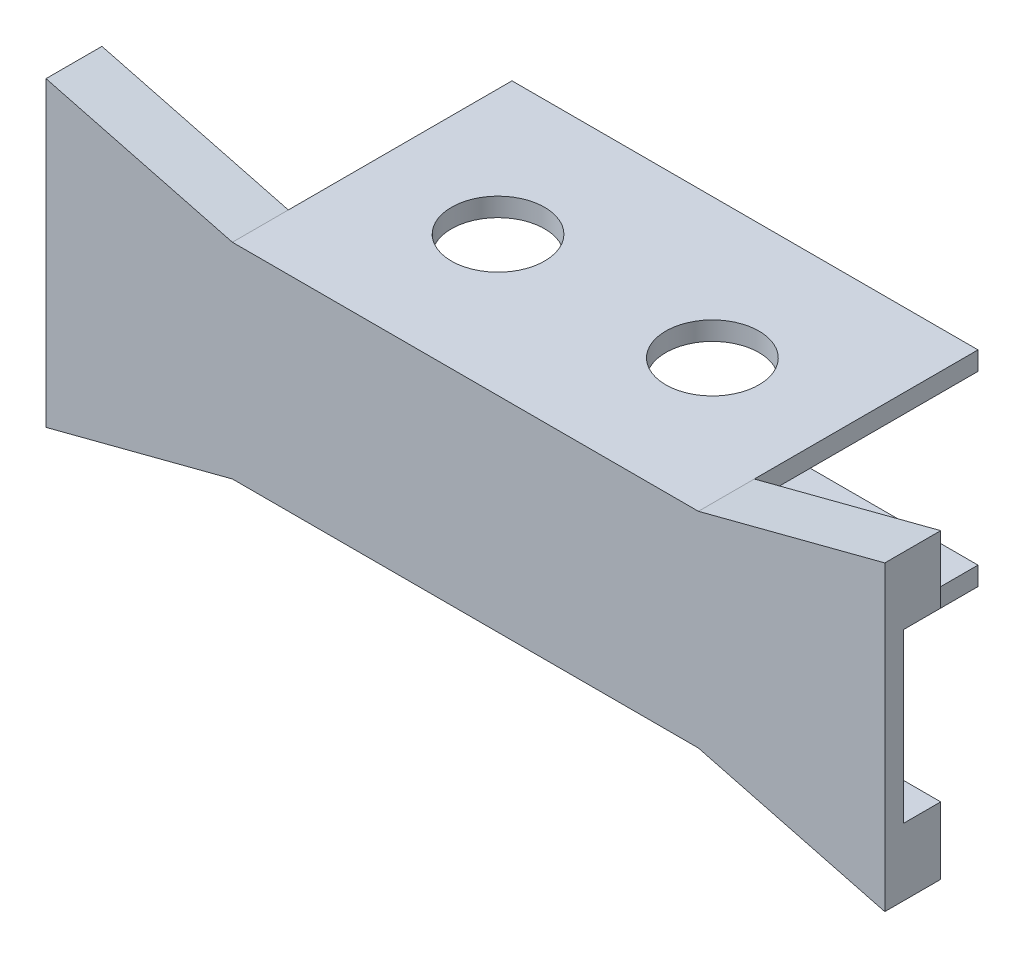
ISO-10303-21;
HEADER;
FILE_DESCRIPTION(('STEP AP214'),'2;1');
FILE_NAME('part.step','',(''),(''),'','','');
FILE_SCHEMA(('AUTOMOTIVE_DESIGN { 1 0 10303 214 1 1 1 1 }'));
ENDSEC;
DATA;
#1=APPLICATION_CONTEXT('core data for automotive mechanical design processes');
#2=APPLICATION_PROTOCOL_DEFINITION('international standard','automotive_design',2000,#1);
#3=PRODUCT_CONTEXT('',#1,'mechanical');
#4=PRODUCT('Part','Part','',(#3));
#5=PRODUCT_RELATED_PRODUCT_CATEGORY('part','',(#4));
#6=PRODUCT_DEFINITION_FORMATION('','',#4);
#7=PRODUCT_DEFINITION_CONTEXT('part definition',#1,'design');
#8=PRODUCT_DEFINITION('design','',#6,#7);
#9=PRODUCT_DEFINITION_SHAPE('','',#8);
#10=(LENGTH_UNIT() NAMED_UNIT(*) SI_UNIT(.MILLI.,.METRE.));
#11=(NAMED_UNIT(*) PLANE_ANGLE_UNIT() SI_UNIT($,.RADIAN.));
#12=(NAMED_UNIT(*) SI_UNIT($,.STERADIAN.) SOLID_ANGLE_UNIT());
#13=UNCERTAINTY_MEASURE_WITH_UNIT(LENGTH_MEASURE(1.E-05),#10,'distance_accuracy_value','');
#14=(GEOMETRIC_REPRESENTATION_CONTEXT(3) GLOBAL_UNCERTAINTY_ASSIGNED_CONTEXT((#13)) GLOBAL_UNIT_ASSIGNED_CONTEXT((#10,
#11,#12)) REPRESENTATION_CONTEXT('',''));
#15=CARTESIAN_POINT('',(0.,0.,0.));
#16=DIRECTION('',(0.,0.,1.));
#17=DIRECTION('',(1.,0.,0.));
#18=AXIS2_PLACEMENT_3D('',#15,#16,#17);
#19=CARTESIAN_POINT('',(-43.8144329896907,2.,0.));
#20=DIRECTION('',(-1.,0.,0.));
#21=DIRECTION('',(0.,0.,1.));
#22=AXIS2_PLACEMENT_3D('',#19,#20,#21);
#23=PLANE('',#22);
#24=DIRECTION('',(0.,0.,-1.));
#25=VECTOR('',#24,1.);
#26=CARTESIAN_POINT('',(-43.8144329896907,0.,0.));
#27=LINE('',#26,#25);
#28=CARTESIAN_POINT('',(-43.8144329896907,0.,8.07216494845362));
#29=VERTEX_POINT('',#28);
#30=CARTESIAN_POINT('',(-43.8144329896907,0.,-15.9278350515464));
#31=VERTEX_POINT('',#30);
#32=EDGE_CURVE('E73',#29,#31,#27,.T.);
#33=ORIENTED_EDGE('',*,*,#32,.F.);
#34=DIRECTION('',(0.,-1.,0.));
#35=VECTOR('',#34,1.);
#36=CARTESIAN_POINT('',(-43.8144329896907,0.,8.07216494845362));
#37=LINE('',#36,#35);
#38=CARTESIAN_POINT('',(-43.8144329896907,2.,8.07216494845362));
#39=VERTEX_POINT('',#38);
#40=EDGE_CURVE('E291',#39,#29,#37,.T.);
#41=ORIENTED_EDGE('',*,*,#40,.F.);
#42=DIRECTION('',(0.,0.,-1.));
#43=VECTOR('',#42,1.);
#44=CARTESIAN_POINT('',(-43.8144329896907,2.,0.));
#45=LINE('',#44,#43);
#46=CARTESIAN_POINT('',(-43.8144329896907,2.,-15.9278350515464));
#47=VERTEX_POINT('',#46);
#48=EDGE_CURVE('E310',#39,#47,#45,.T.);
#49=ORIENTED_EDGE('',*,*,#48,.T.);
#50=DIRECTION('',(0.,-1.,0.));
#51=VECTOR('',#50,1.);
#52=CARTESIAN_POINT('',(-43.8144329896907,2.,-15.9278350515464));
#53=LINE('',#52,#51);
#54=EDGE_CURVE('E47',#47,#31,#53,.T.);
#55=ORIENTED_EDGE('',*,*,#54,.T.);
#56=EDGE_LOOP('',(#33,#41,#49,#55));
#57=FACE_BOUND('',#56,.T.);
#58=ADVANCED_FACE('F43',(#57),#23,.T.);
#59=CARTESIAN_POINT('',(6.18556701030928,2.,0.));
#60=DIRECTION('',(-1.,0.,0.));
#61=DIRECTION('',(0.,0.,1.));
#62=AXIS2_PLACEMENT_3D('',#59,#60,#61);
#63=PLANE('',#62);
#64=DIRECTION('',(0.,1.,0.));
#65=VECTOR('',#64,1.);
#66=CARTESIAN_POINT('',(6.18556701030928,0.,8.07216494845362));
#67=LINE('',#66,#65);
#68=CARTESIAN_POINT('',(6.18556701030928,0.,8.07216494845362));
#69=VERTEX_POINT('',#68);
#70=CARTESIAN_POINT('',(6.18556701030928,2.,8.07216494845362));
#71=VERTEX_POINT('',#70);
#72=EDGE_CURVE('E271',#69,#71,#67,.T.);
#73=ORIENTED_EDGE('',*,*,#72,.F.);
#74=DIRECTION('',(0.,0.,-1.));
#75=VECTOR('',#74,1.);
#76=CARTESIAN_POINT('',(6.18556701030928,0.,0.));
#77=LINE('',#76,#75);
#78=CARTESIAN_POINT('',(6.18556701030928,0.,-15.9278350515464));
#79=VERTEX_POINT('',#78);
#80=EDGE_CURVE('E329',#69,#79,#77,.T.);
#81=ORIENTED_EDGE('',*,*,#80,.T.);
#82=DIRECTION('',(0.,-1.,0.));
#83=VECTOR('',#82,1.);
#84=CARTESIAN_POINT('',(6.18556701030928,2.,-15.9278350515464));
#85=LINE('',#84,#83);
#86=CARTESIAN_POINT('',(6.18556701030928,2.,-15.9278350515464));
#87=VERTEX_POINT('',#86);
#88=EDGE_CURVE('E325',#87,#79,#85,.T.);
#89=ORIENTED_EDGE('',*,*,#88,.F.);
#90=DIRECTION('',(0.,0.,-1.));
#91=VECTOR('',#90,1.);
#92=CARTESIAN_POINT('',(6.18556701030928,2.,0.));
#93=LINE('',#92,#91);
#94=EDGE_CURVE('E61',#71,#87,#93,.T.);
#95=ORIENTED_EDGE('',*,*,#94,.F.);
#96=EDGE_LOOP('',(#73,#81,#89,#95));
#97=FACE_BOUND('',#96,.T.);
#98=ADVANCED_FACE('F346',(#97),#63,.F.);
#99=CARTESIAN_POINT('',(0.,0.,0.));
#100=DIRECTION('',(0.,1.,0.));
#101=DIRECTION('',(0.,0.,1.));
#102=AXIS2_PLACEMENT_3D('',#99,#100,#101);
#103=PLANE('',#102);
#104=CARTESIAN_POINT('',(-30.3144329896907,0.,-0.927835051546382));
#105=DIRECTION('',(0.,1.,0.));
#106=DIRECTION('',(0.,0.,1.));
#107=AXIS2_PLACEMENT_3D('',#104,#105,#106);
#108=CIRCLE('',#107,5.);
#109=CARTESIAN_POINT('',(-30.3144329896907,0.,4.07216494845362));
#110=VERTEX_POINT('',#109);
#111=EDGE_CURVE('E311',#110,#110,#108,.T.);
#112=ORIENTED_EDGE('',*,*,#111,.T.);
#113=EDGE_LOOP('',(#112));
#114=FACE_BOUND('',#113,.T.);
#115=CARTESIAN_POINT('',(-7.31443298969072,0.,-0.927835051546382));
#116=DIRECTION('',(0.,1.,0.));
#117=DIRECTION('',(0.,0.,1.));
#118=AXIS2_PLACEMENT_3D('',#115,#116,#117);
#119=CIRCLE('',#118,5.);
#120=CARTESIAN_POINT('',(-7.31443298969072,0.,4.07216494845362));
#121=VERTEX_POINT('',#120);
#122=EDGE_CURVE('E331',#121,#121,#119,.T.);
#123=ORIENTED_EDGE('',*,*,#122,.T.);
#124=EDGE_LOOP('',(#123));
#125=FACE_BOUND('',#124,.T.);
#126=DIRECTION('',(1.,0.,0.));
#127=VECTOR('',#126,1.);
#128=CARTESIAN_POINT('',(0.,0.,12.0721649484536));
#129=LINE('',#128,#127);
#130=CARTESIAN_POINT('',(-63.8144329896907,0.,12.0721649484536));
#131=VERTEX_POINT('',#130);
#132=CARTESIAN_POINT('',(26.1855670103093,0.,12.0721649484536));
#133=VERTEX_POINT('',#132);
#134=EDGE_CURVE('E11',#131,#133,#129,.T.);
#135=ORIENTED_EDGE('',*,*,#134,.F.);
#136=DIRECTION('',(0.,0.,1.));
#137=VECTOR('',#136,1.);
#138=CARTESIAN_POINT('',(-63.8144329896907,0.,8.07216494845362));
#139=LINE('',#138,#137);
#140=CARTESIAN_POINT('',(-63.8144329896907,0.,8.07216494845362));
#141=VERTEX_POINT('',#140);
#142=EDGE_CURVE('E279',#141,#131,#139,.T.);
#143=ORIENTED_EDGE('',*,*,#142,.F.);
#144=DIRECTION('',(-1.,0.,0.));
#145=VECTOR('',#144,1.);
#146=CARTESIAN_POINT('',(0.,0.,8.07216494845362));
#147=LINE('',#146,#145);
#148=EDGE_CURVE('E289',#29,#141,#147,.T.);
#149=ORIENTED_EDGE('',*,*,#148,.F.);
#150=ORIENTED_EDGE('',*,*,#32,.T.);
#151=DIRECTION('',(-1.,0.,0.));
#152=VECTOR('',#151,1.);
#153=CARTESIAN_POINT('',(0.,0.,-15.9278350515464));
#154=LINE('',#153,#152);
#155=EDGE_CURVE('E305',#79,#31,#154,.T.);
#156=ORIENTED_EDGE('',*,*,#155,.F.);
#157=ORIENTED_EDGE('',*,*,#80,.F.);
#158=DIRECTION('',(1.,0.,0.));
#159=VECTOR('',#158,1.);
#160=CARTESIAN_POINT('',(0.,0.,8.07216494845362));
#161=LINE('',#160,#159);
#162=CARTESIAN_POINT('',(26.1855670103093,0.,8.07216494845362));
#163=VERTEX_POINT('',#162);
#164=EDGE_CURVE('E273',#69,#163,#161,.T.);
#165=ORIENTED_EDGE('',*,*,#164,.T.);
#166=DIRECTION('',(0.,0.,1.));
#167=VECTOR('',#166,1.);
#168=CARTESIAN_POINT('',(26.1855670103093,0.,8.07216494845362));
#169=LINE('',#168,#167);
#170=EDGE_CURVE('E280',#163,#133,#169,.T.);
#171=ORIENTED_EDGE('',*,*,#170,.T.);
#172=EDGE_LOOP('',(#135,#143,#149,#150,#156,#157,#165,#171));
#173=FACE_BOUND('',#172,.T.);
#174=ADVANCED_FACE('F343',(#114,#125,#173),#103,.F.);
#175=CARTESIAN_POINT('',(0.,2.,-15.9278350515464));
#176=DIRECTION('',(0.,0.,1.));
#177=DIRECTION('',(1.,0.,0.));
#178=AXIS2_PLACEMENT_3D('',#175,#176,#177);
#179=PLANE('',#178);
#180=ORIENTED_EDGE('',*,*,#155,.T.);
#181=ORIENTED_EDGE('',*,*,#54,.F.);
#182=DIRECTION('',(-1.,0.,0.));
#183=VECTOR('',#182,1.);
#184=CARTESIAN_POINT('',(0.,2.,-15.9278350515464));
#185=LINE('',#184,#183);
#186=EDGE_CURVE('E308',#87,#47,#185,.T.);
#187=ORIENTED_EDGE('',*,*,#186,.F.);
#188=ORIENTED_EDGE('',*,*,#88,.T.);
#189=EDGE_LOOP('',(#180,#181,#187,#188));
#190=FACE_BOUND('',#189,.T.);
#191=ADVANCED_FACE('F45',(#190),#179,.F.);
#192=CARTESIAN_POINT('',(0.,2.,14.0721649484536));
#193=DIRECTION('',(0.,0.,1.));
#194=DIRECTION('',(1.,0.,0.));
#195=AXIS2_PLACEMENT_3D('',#192,#193,#194);
#196=PLANE('',#195);
#197=DIRECTION('',(-1.,0.,0.));
#198=VECTOR('',#197,1.);
#199=CARTESIAN_POINT('',(0.,2.,14.0721649484536));
#200=LINE('',#199,#198);
#201=CARTESIAN_POINT('',(6.18556701030928,2.,14.0721649484536));
#202=VERTEX_POINT('',#201);
#203=CARTESIAN_POINT('',(-43.8144329896907,2.,14.0721649484536));
#204=VERTEX_POINT('',#203);
#205=EDGE_CURVE('E314',#202,#204,#200,.T.);
#206=ORIENTED_EDGE('',*,*,#205,.T.);
#207=DIRECTION('',(-0.967786736386229,0.251771390103984,0.));
#208=VECTOR('',#207,1.);
#209=CARTESIAN_POINT('',(-2.29002374640336,-8.80264674577735,14.0721649484536));
#210=LINE('',#209,#208);
#211=CARTESIAN_POINT('',(-63.8144329896907,7.20303452481923,14.0721649484536));
#212=VERTEX_POINT('',#211);
#213=EDGE_CURVE('E229',#204,#212,#210,.T.);
#214=ORIENTED_EDGE('',*,*,#213,.T.);
#215=DIRECTION('',(0.,-1.,0.));
#216=VECTOR('',#215,1.);
#217=CARTESIAN_POINT('',(-63.8144329896907,0.,14.0721649484536));
#218=LINE('',#217,#216);
#219=CARTESIAN_POINT('',(-63.8144329896907,-25.2030345248192,14.0721649484536));
#220=VERTEX_POINT('',#219);
#221=EDGE_CURVE('E302',#212,#220,#218,.T.);
#222=ORIENTED_EDGE('',*,*,#221,.T.);
#223=DIRECTION('',(-0.967786736386229,-0.251771390103984,0.));
#224=VECTOR('',#223,1.);
#225=CARTESIAN_POINT('',(-2.29002374640336,-9.19735325422265,14.0721649484536));
#226=LINE('',#225,#224);
#227=CARTESIAN_POINT('',(-43.8144329896907,-20.,14.0721649484536));
#228=VERTEX_POINT('',#227);
#229=EDGE_CURVE('E210',#228,#220,#226,.T.);
#230=ORIENTED_EDGE('',*,*,#229,.F.);
#231=DIRECTION('',(-1.,0.,0.));
#232=VECTOR('',#231,1.);
#233=CARTESIAN_POINT('',(0.,-20.,14.0721649484536));
#234=LINE('',#233,#232);
#235=CARTESIAN_POINT('',(6.18556701030928,-20.,14.0721649484536));
#236=VERTEX_POINT('',#235);
#237=EDGE_CURVE('E238',#236,#228,#234,.T.);
#238=ORIENTED_EDGE('',*,*,#237,.F.);
#239=DIRECTION('',(0.967786736386229,-0.251771390103984,0.));
#240=VECTOR('',#239,1.);
#241=CARTESIAN_POINT('',(-0.095226150435374,-18.3660408170698,14.0721649484536));
#242=LINE('',#241,#240);
#243=CARTESIAN_POINT('',(26.1855670103093,-25.2030345248192,14.0721649484536));
#244=VERTEX_POINT('',#243);
#245=EDGE_CURVE('E195',#236,#244,#242,.T.);
#246=ORIENTED_EDGE('',*,*,#245,.T.);
#247=DIRECTION('',(0.,-1.,0.));
#248=VECTOR('',#247,1.);
#249=CARTESIAN_POINT('',(26.1855670103093,0.,14.0721649484536));
#250=LINE('',#249,#248);
#251=CARTESIAN_POINT('',(26.1855670103093,7.20303452481923,14.0721649484536));
#252=VERTEX_POINT('',#251);
#253=EDGE_CURVE('E199',#252,#244,#250,.T.);
#254=ORIENTED_EDGE('',*,*,#253,.F.);
#255=DIRECTION('',(0.967786736386229,0.251771390103984,0.));
#256=VECTOR('',#255,1.);
#257=CARTESIAN_POINT('',(-0.095226150435374,0.366040817069852,14.0721649484536));
#258=LINE('',#257,#256);
#259=EDGE_CURVE('E269',#202,#252,#258,.T.);
#260=ORIENTED_EDGE('',*,*,#259,.F.);
#261=EDGE_LOOP('',(#206,#214,#222,#230,#238,#246,#254,#260));
#262=FACE_BOUND('',#261,.T.);
#263=ADVANCED_FACE('F378',(#262),#196,.T.);
#264=CARTESIAN_POINT('',(-7.31443298969072,2.,-0.927835051546382));
#265=DIRECTION('',(0.,-1.,0.));
#266=DIRECTION('',(0.,0.,-1.));
#267=AXIS2_PLACEMENT_3D('',#264,#265,#266);
#268=CYLINDRICAL_SURFACE('',#267,5.);
#269=CARTESIAN_POINT('',(-7.31443298969072,2.,-0.927835051546382));
#270=DIRECTION('',(0.,1.,0.));
#271=DIRECTION('',(0.,0.,1.));
#272=AXIS2_PLACEMENT_3D('',#269,#270,#271);
#273=CIRCLE('',#272,5.);
#274=CARTESIAN_POINT('',(-7.31443298969072,2.,4.07216494845362));
#275=VERTEX_POINT('',#274);
#276=EDGE_CURVE('E319',#275,#275,#273,.T.);
#277=ORIENTED_EDGE('',*,*,#276,.T.);
#278=EDGE_LOOP('',(#277));
#279=FACE_BOUND('',#278,.T.);
#280=ORIENTED_EDGE('',*,*,#122,.F.);
#281=EDGE_LOOP('',(#280));
#282=FACE_BOUND('',#281,.T.);
#283=ADVANCED_FACE('F414',(#279,#282),#268,.F.);
#284=CARTESIAN_POINT('',(-30.3144329896907,2.,-0.927835051546382));
#285=DIRECTION('',(0.,-1.,0.));
#286=DIRECTION('',(0.,0.,-1.));
#287=AXIS2_PLACEMENT_3D('',#284,#285,#286);
#288=CYLINDRICAL_SURFACE('',#287,5.);
#289=CARTESIAN_POINT('',(-30.3144329896907,2.,-0.927835051546382));
#290=DIRECTION('',(0.,1.,0.));
#291=DIRECTION('',(0.,0.,1.));
#292=AXIS2_PLACEMENT_3D('',#289,#290,#291);
#293=CIRCLE('',#292,5.);
#294=CARTESIAN_POINT('',(-30.3144329896907,2.,4.07216494845362));
#295=VERTEX_POINT('',#294);
#296=EDGE_CURVE('E322',#295,#295,#293,.T.);
#297=ORIENTED_EDGE('',*,*,#296,.T.);
#298=EDGE_LOOP('',(#297));
#299=FACE_BOUND('',#298,.T.);
#300=ORIENTED_EDGE('',*,*,#111,.F.);
#301=EDGE_LOOP('',(#300));
#302=FACE_BOUND('',#301,.T.);
#303=ADVANCED_FACE('F418',(#299,#302),#288,.F.);
#304=CARTESIAN_POINT('',(0.,2.,0.));
#305=DIRECTION('',(0.,1.,0.));
#306=DIRECTION('',(0.,0.,1.));
#307=AXIS2_PLACEMENT_3D('',#304,#305,#306);
#308=PLANE('',#307);
#309=ORIENTED_EDGE('',*,*,#186,.T.);
#310=ORIENTED_EDGE('',*,*,#48,.F.);
#311=EDGE_CURVE('E312',#204,#39,#45,.T.);
#312=ORIENTED_EDGE('',*,*,#311,.F.);
#313=ORIENTED_EDGE('',*,*,#205,.F.);
#314=EDGE_CURVE('E317',#202,#71,#93,.T.);
#315=ORIENTED_EDGE('',*,*,#314,.T.);
#316=ORIENTED_EDGE('',*,*,#94,.T.);
#317=EDGE_LOOP('',(#309,#310,#312,#313,#315,#316));
#318=FACE_BOUND('',#317,.T.);
#319=ORIENTED_EDGE('',*,*,#276,.F.);
#320=EDGE_LOOP('',(#319));
#321=FACE_BOUND('',#320,.T.);
#322=ORIENTED_EDGE('',*,*,#296,.F.);
#323=EDGE_LOOP('',(#322));
#324=FACE_BOUND('',#323,.T.);
#325=ADVANCED_FACE('F422',(#318,#321,#324),#308,.T.);
#326=CARTESIAN_POINT('',(26.1855670103093,0.,12.0721649484536));
#327=DIRECTION('',(-1.,0.,0.));
#328=DIRECTION('',(0.,0.,1.));
#329=AXIS2_PLACEMENT_3D('',#326,#327,#328);
#330=PLANE('',#329);
#331=ORIENTED_EDGE('',*,*,#253,.T.);
#332=DIRECTION('',(0.,0.,1.));
#333=VECTOR('',#332,1.);
#334=CARTESIAN_POINT('',(26.1855670103093,-25.2030345248192,8.07216494845362));
#335=LINE('',#334,#333);
#336=CARTESIAN_POINT('',(26.1855670103093,-25.2030345248192,8.07216494845362));
#337=VERTEX_POINT('',#336);
#338=EDGE_CURVE('E180',#337,#244,#335,.T.);
#339=ORIENTED_EDGE('',*,*,#338,.F.);
#340=DIRECTION('',(0.,1.,0.));
#341=VECTOR('',#340,1.);
#342=CARTESIAN_POINT('',(26.1855670103093,-18.,8.07216494845362));
#343=LINE('',#342,#341);
#344=CARTESIAN_POINT('',(26.1855670103093,-18.,8.07216494845362));
#345=VERTEX_POINT('',#344);
#346=EDGE_CURVE('E187',#337,#345,#343,.T.);
#347=ORIENTED_EDGE('',*,*,#346,.T.);
#348=DIRECTION('',(0.,0.,1.));
#349=VECTOR('',#348,1.);
#350=CARTESIAN_POINT('',(26.1855670103093,-18.,8.07216494845362));
#351=LINE('',#350,#349);
#352=CARTESIAN_POINT('',(26.1855670103093,-18.,12.0721649484536));
#353=VERTEX_POINT('',#352);
#354=EDGE_CURVE('E200',#345,#353,#351,.T.);
#355=ORIENTED_EDGE('',*,*,#354,.T.);
#356=DIRECTION('',(0.,-1.,0.));
#357=VECTOR('',#356,1.);
#358=CARTESIAN_POINT('',(26.1855670103093,0.,12.0721649484536));
#359=LINE('',#358,#357);
#360=EDGE_CURVE('E300',#133,#353,#359,.T.);
#361=ORIENTED_EDGE('',*,*,#360,.F.);
#362=ORIENTED_EDGE('',*,*,#170,.F.);
#363=DIRECTION('',(0.,-1.,0.));
#364=VECTOR('',#363,1.);
#365=CARTESIAN_POINT('',(26.1855670103093,0.,8.07216494845362));
#366=LINE('',#365,#364);
#367=CARTESIAN_POINT('',(26.1855670103093,7.20303452481923,8.07216494845362));
#368=VERTEX_POINT('',#367);
#369=EDGE_CURVE('E266',#368,#163,#366,.T.);
#370=ORIENTED_EDGE('',*,*,#369,.F.);
#371=DIRECTION('',(0.,0.,1.));
#372=VECTOR('',#371,1.);
#373=CARTESIAN_POINT('',(26.1855670103093,7.20303452481923,8.07216494845362));
#374=LINE('',#373,#372);
#375=EDGE_CURVE('E276',#368,#252,#374,.T.);
#376=ORIENTED_EDGE('',*,*,#375,.T.);
#377=EDGE_LOOP('',(#331,#339,#347,#355,#361,#362,#370,#376));
#378=FACE_BOUND('',#377,.T.);
#379=ADVANCED_FACE('F197',(#378),#330,.F.);
#380=CARTESIAN_POINT('',(-63.8144329896907,0.,12.0721649484536));
#381=DIRECTION('',(-1.,0.,0.));
#382=DIRECTION('',(0.,0.,1.));
#383=AXIS2_PLACEMENT_3D('',#380,#381,#382);
#384=PLANE('',#383);
#385=ORIENTED_EDGE('',*,*,#221,.F.);
#386=DIRECTION('',(0.,0.,1.));
#387=VECTOR('',#386,1.);
#388=CARTESIAN_POINT('',(-63.8144329896907,7.20303452481923,8.07216494845362));
#389=LINE('',#388,#387);
#390=CARTESIAN_POINT('',(-63.8144329896907,7.20303452481923,8.07216494845362));
#391=VERTEX_POINT('',#390);
#392=EDGE_CURVE('E293',#391,#212,#389,.T.);
#393=ORIENTED_EDGE('',*,*,#392,.F.);
#394=DIRECTION('',(0.,-1.,0.));
#395=VECTOR('',#394,1.);
#396=CARTESIAN_POINT('',(-63.8144329896907,0.,8.07216494845362));
#397=LINE('',#396,#395);
#398=EDGE_CURVE('E286',#391,#141,#397,.T.);
#399=ORIENTED_EDGE('',*,*,#398,.T.);
#400=ORIENTED_EDGE('',*,*,#142,.T.);
#401=DIRECTION('',(0.,-1.,0.));
#402=VECTOR('',#401,1.);
#403=CARTESIAN_POINT('',(-63.8144329896907,0.,12.0721649484536));
#404=LINE('',#403,#402);
#405=CARTESIAN_POINT('',(-63.8144329896907,-18.,12.0721649484536));
#406=VERTEX_POINT('',#405);
#407=EDGE_CURVE('E301',#131,#406,#404,.T.);
#408=ORIENTED_EDGE('',*,*,#407,.T.);
#409=DIRECTION('',(0.,0.,1.));
#410=VECTOR('',#409,1.);
#411=CARTESIAN_POINT('',(-63.8144329896907,-18.,8.07216494845362));
#412=LINE('',#411,#410);
#413=CARTESIAN_POINT('',(-63.8144329896907,-18.,8.07216494845362));
#414=VERTEX_POINT('',#413);
#415=EDGE_CURVE('E221',#414,#406,#412,.T.);
#416=ORIENTED_EDGE('',*,*,#415,.F.);
#417=DIRECTION('',(0.,1.,0.));
#418=VECTOR('',#417,1.);
#419=CARTESIAN_POINT('',(-63.8144329896907,-18.,8.07216494845362));
#420=LINE('',#419,#418);
#421=CARTESIAN_POINT('',(-63.8144329896907,-25.2030345248192,8.07216494845362));
#422=VERTEX_POINT('',#421);
#423=EDGE_CURVE('E209',#422,#414,#420,.T.);
#424=ORIENTED_EDGE('',*,*,#423,.F.);
#425=DIRECTION('',(0.,0.,1.));
#426=VECTOR('',#425,1.);
#427=CARTESIAN_POINT('',(-63.8144329896907,-25.2030345248192,8.07216494845362));
#428=LINE('',#427,#426);
#429=EDGE_CURVE('E218',#422,#220,#428,.T.);
#430=ORIENTED_EDGE('',*,*,#429,.T.);
#431=EDGE_LOOP('',(#385,#393,#399,#400,#408,#416,#424,#430));
#432=FACE_BOUND('',#431,.T.);
#433=ADVANCED_FACE('F359',(#432),#384,.T.);
#434=CARTESIAN_POINT('',(0.,0.,12.0721649484536));
#435=DIRECTION('',(0.,0.,1.));
#436=DIRECTION('',(1.,0.,0.));
#437=AXIS2_PLACEMENT_3D('',#434,#435,#436);
#438=PLANE('',#437);
#439=ORIENTED_EDGE('',*,*,#360,.T.);
#440=DIRECTION('',(1.,0.,0.));
#441=VECTOR('',#440,1.);
#442=CARTESIAN_POINT('',(0.,-18.,12.0721649484536));
#443=LINE('',#442,#441);
#444=EDGE_CURVE('E226',#406,#353,#443,.T.);
#445=ORIENTED_EDGE('',*,*,#444,.F.);
#446=ORIENTED_EDGE('',*,*,#407,.F.);
#447=ORIENTED_EDGE('',*,*,#134,.T.);
#448=EDGE_LOOP('',(#439,#445,#446,#447));
#449=FACE_BOUND('',#448,.T.);
#450=ADVANCED_FACE('F363',(#449),#438,.F.);
#451=CARTESIAN_POINT('',(-2.29002374640336,-8.80264674577735,8.07216494845362));
#452=DIRECTION('',(0.251771390103984,0.967786736386229,0.));
#453=DIRECTION('',(-0.967786736386229,0.251771390103984,0.));
#454=AXIS2_PLACEMENT_3D('',#451,#452,#453);
#455=PLANE('',#454);
#456=ORIENTED_EDGE('',*,*,#213,.F.);
#457=ORIENTED_EDGE('',*,*,#311,.T.);
#458=DIRECTION('',(-0.967786736386229,0.251771390103984,0.));
#459=VECTOR('',#458,1.);
#460=CARTESIAN_POINT('',(-2.29002374640336,-8.80264674577735,8.07216494845362));
#461=LINE('',#460,#459);
#462=EDGE_CURVE('E283',#39,#391,#461,.T.);
#463=ORIENTED_EDGE('',*,*,#462,.T.);
#464=ORIENTED_EDGE('',*,*,#392,.T.);
#465=EDGE_LOOP('',(#456,#457,#463,#464));
#466=FACE_BOUND('',#465,.T.);
#467=ADVANCED_FACE('F434',(#466),#455,.T.);
#468=CARTESIAN_POINT('',(0.,0.,8.07216494845362));
#469=DIRECTION('',(0.,0.,1.));
#470=DIRECTION('',(1.,0.,0.));
#471=AXIS2_PLACEMENT_3D('',#468,#469,#470);
#472=PLANE('',#471);
#473=ORIENTED_EDGE('',*,*,#462,.F.);
#474=ORIENTED_EDGE('',*,*,#40,.T.);
#475=ORIENTED_EDGE('',*,*,#148,.T.);
#476=ORIENTED_EDGE('',*,*,#398,.F.);
#477=EDGE_LOOP('',(#473,#474,#475,#476));
#478=FACE_BOUND('',#477,.T.);
#479=ADVANCED_FACE('F437',(#478),#472,.F.);
#480=CARTESIAN_POINT('',(-0.095226150435374,0.366040817069852,8.07216494845362));
#481=DIRECTION('',(0.251771390103984,-0.967786736386229,0.));
#482=DIRECTION('',(0.967786736386229,0.251771390103984,0.));
#483=AXIS2_PLACEMENT_3D('',#480,#481,#482);
#484=PLANE('',#483);
#485=ORIENTED_EDGE('',*,*,#259,.T.);
#486=ORIENTED_EDGE('',*,*,#375,.F.);
#487=DIRECTION('',(0.967786736386229,0.251771390103984,0.));
#488=VECTOR('',#487,1.);
#489=CARTESIAN_POINT('',(-0.095226150435374,0.366040817069852,8.07216494845362));
#490=LINE('',#489,#488);
#491=EDGE_CURVE('E268',#71,#368,#490,.T.);
#492=ORIENTED_EDGE('',*,*,#491,.F.);
#493=ORIENTED_EDGE('',*,*,#314,.F.);
#494=EDGE_LOOP('',(#485,#486,#492,#493));
#495=FACE_BOUND('',#494,.T.);
#496=ADVANCED_FACE('F352',(#495),#484,.F.);
#497=CARTESIAN_POINT('',(0.,0.,8.07216494845362));
#498=DIRECTION('',(0.,0.,1.));
#499=DIRECTION('',(1.,0.,0.));
#500=AXIS2_PLACEMENT_3D('',#497,#498,#499);
#501=PLANE('',#500);
#502=ORIENTED_EDGE('',*,*,#369,.T.);
#503=ORIENTED_EDGE('',*,*,#164,.F.);
#504=ORIENTED_EDGE('',*,*,#72,.T.);
#505=ORIENTED_EDGE('',*,*,#491,.T.);
#506=EDGE_LOOP('',(#502,#503,#504,#505));
#507=FACE_BOUND('',#506,.T.);
#508=ADVANCED_FACE('F349',(#507),#501,.F.);
#509=CARTESIAN_POINT('',(-43.8144329896907,-20.,0.));
#510=DIRECTION('',(-1.,0.,0.));
#511=DIRECTION('',(0.,0.,1.));
#512=AXIS2_PLACEMENT_3D('',#509,#510,#511);
#513=PLANE('',#512);
#514=DIRECTION('',(0.,0.,-1.));
#515=VECTOR('',#514,1.);
#516=CARTESIAN_POINT('',(-43.8144329896907,-18.,0.));
#517=LINE('',#516,#515);
#518=CARTESIAN_POINT('',(-43.8144329896907,-18.,8.07216494845362));
#519=VERTEX_POINT('',#518);
#520=CARTESIAN_POINT('',(-43.8144329896907,-18.,-15.9278350515464));
#521=VERTEX_POINT('',#520);
#522=EDGE_CURVE('E251',#519,#521,#517,.T.);
#523=ORIENTED_EDGE('',*,*,#522,.T.);
#524=DIRECTION('',(0.,1.,0.));
#525=VECTOR('',#524,1.);
#526=CARTESIAN_POINT('',(-43.8144329896907,-20.,-15.9278350515464));
#527=LINE('',#526,#525);
#528=CARTESIAN_POINT('',(-43.8144329896907,-20.,-15.9278350515464));
#529=VERTEX_POINT('',#528);
#530=EDGE_CURVE('E230',#529,#521,#527,.T.);
#531=ORIENTED_EDGE('',*,*,#530,.F.);
#532=DIRECTION('',(0.,0.,-1.));
#533=VECTOR('',#532,1.);
#534=CARTESIAN_POINT('',(-43.8144329896907,-20.,0.));
#535=LINE('',#534,#533);
#536=CARTESIAN_POINT('',(-43.8144329896907,-20.,8.07216494845362));
#537=VERTEX_POINT('',#536);
#538=EDGE_CURVE('E233',#537,#529,#535,.T.);
#539=ORIENTED_EDGE('',*,*,#538,.F.);
#540=DIRECTION('',(0.,1.,0.));
#541=VECTOR('',#540,1.);
#542=CARTESIAN_POINT('',(-43.8144329896907,-18.,8.07216494845362));
#543=LINE('',#542,#541);
#544=EDGE_CURVE('E215',#537,#519,#543,.T.);
#545=ORIENTED_EDGE('',*,*,#544,.T.);
#546=EDGE_LOOP('',(#523,#531,#539,#545));
#547=FACE_BOUND('',#546,.T.);
#548=ADVANCED_FACE('F394',(#547),#513,.T.);
#549=CARTESIAN_POINT('',(6.18556701030928,-20.,0.));
#550=DIRECTION('',(-1.,0.,0.));
#551=DIRECTION('',(0.,0.,1.));
#552=AXIS2_PLACEMENT_3D('',#549,#550,#551);
#553=PLANE('',#552);
#554=DIRECTION('',(0.,-1.,0.));
#555=VECTOR('',#554,1.);
#556=CARTESIAN_POINT('',(6.18556701030928,-18.,8.07216494845362));
#557=LINE('',#556,#555);
#558=CARTESIAN_POINT('',(6.18556701030928,-18.,8.07216494845362));
#559=VERTEX_POINT('',#558);
#560=CARTESIAN_POINT('',(6.18556701030928,-20.,8.07216494845362));
#561=VERTEX_POINT('',#560);
#562=EDGE_CURVE('E186',#559,#561,#557,.T.);
#563=ORIENTED_EDGE('',*,*,#562,.T.);
#564=DIRECTION('',(0.,0.,-1.));
#565=VECTOR('',#564,1.);
#566=CARTESIAN_POINT('',(6.18556701030928,-20.,0.));
#567=LINE('',#566,#565);
#568=CARTESIAN_POINT('',(6.18556701030928,-20.,-15.9278350515464));
#569=VERTEX_POINT('',#568);
#570=EDGE_CURVE('E241',#561,#569,#567,.T.);
#571=ORIENTED_EDGE('',*,*,#570,.T.);
#572=DIRECTION('',(0.,1.,0.));
#573=VECTOR('',#572,1.);
#574=CARTESIAN_POINT('',(6.18556701030928,-20.,-15.9278350515464));
#575=LINE('',#574,#573);
#576=CARTESIAN_POINT('',(6.18556701030928,-18.,-15.9278350515464));
#577=VERTEX_POINT('',#576);
#578=EDGE_CURVE('E249',#569,#577,#575,.T.);
#579=ORIENTED_EDGE('',*,*,#578,.T.);
#580=DIRECTION('',(0.,0.,-1.));
#581=VECTOR('',#580,1.);
#582=CARTESIAN_POINT('',(6.18556701030928,-18.,0.));
#583=LINE('',#582,#581);
#584=EDGE_CURVE('E254',#559,#577,#583,.T.);
#585=ORIENTED_EDGE('',*,*,#584,.F.);
#586=EDGE_LOOP('',(#563,#571,#579,#585));
#587=FACE_BOUND('',#586,.T.);
#588=ADVANCED_FACE('F388',(#587),#553,.F.);
#589=CARTESIAN_POINT('',(0.,-18.,0.));
#590=DIRECTION('',(0.,-1.,0.));
#591=DIRECTION('',(0.,0.,1.));
#592=AXIS2_PLACEMENT_3D('',#589,#590,#591);
#593=PLANE('',#592);
#594=CARTESIAN_POINT('',(-30.3144329896907,-18.,-0.927835051546382));
#595=DIRECTION('',(0.,1.,0.));
#596=DIRECTION('',(0.,0.,1.));
#597=AXIS2_PLACEMENT_3D('',#594,#595,#596);
#598=CIRCLE('',#597,5.);
#599=CARTESIAN_POINT('',(-30.3144329896907,-18.,4.07216494845362));
#600=VERTEX_POINT('',#599);
#601=EDGE_CURVE('E234',#600,#600,#598,.T.);
#602=ORIENTED_EDGE('',*,*,#601,.F.);
#603=EDGE_LOOP('',(#602));
#604=FACE_BOUND('',#603,.T.);
#605=CARTESIAN_POINT('',(-7.31443298969072,-18.,-0.927835051546382));
#606=DIRECTION('',(0.,1.,0.));
#607=DIRECTION('',(0.,0.,1.));
#608=AXIS2_PLACEMENT_3D('',#605,#606,#607);
#609=CIRCLE('',#608,5.);
#610=CARTESIAN_POINT('',(-7.31443298969072,-18.,4.07216494845362));
#611=VERTEX_POINT('',#610);
#612=EDGE_CURVE('E257',#611,#611,#609,.T.);
#613=ORIENTED_EDGE('',*,*,#612,.F.);
#614=EDGE_LOOP('',(#613));
#615=FACE_BOUND('',#614,.T.);
#616=ORIENTED_EDGE('',*,*,#444,.T.);
#617=ORIENTED_EDGE('',*,*,#354,.F.);
#618=DIRECTION('',(1.,0.,0.));
#619=VECTOR('',#618,1.);
#620=CARTESIAN_POINT('',(0.,-18.,8.07216494845362));
#621=LINE('',#620,#619);
#622=EDGE_CURVE('E191',#559,#345,#621,.T.);
#623=ORIENTED_EDGE('',*,*,#622,.F.);
#624=ORIENTED_EDGE('',*,*,#584,.T.);
#625=DIRECTION('',(-1.,0.,0.));
#626=VECTOR('',#625,1.);
#627=CARTESIAN_POINT('',(0.,-18.,-15.9278350515464));
#628=LINE('',#627,#626);
#629=EDGE_CURVE('E202',#577,#521,#628,.T.);
#630=ORIENTED_EDGE('',*,*,#629,.T.);
#631=ORIENTED_EDGE('',*,*,#522,.F.);
#632=DIRECTION('',(-1.,0.,0.));
#633=VECTOR('',#632,1.);
#634=CARTESIAN_POINT('',(0.,-18.,8.07216494845362));
#635=LINE('',#634,#633);
#636=EDGE_CURVE('E212',#519,#414,#635,.T.);
#637=ORIENTED_EDGE('',*,*,#636,.T.);
#638=ORIENTED_EDGE('',*,*,#415,.T.);
#639=EDGE_LOOP('',(#616,#617,#623,#624,#630,#631,#637,#638));
#640=FACE_BOUND('',#639,.T.);
#641=ADVANCED_FACE('F365',(#604,#615,#640),#593,.F.);
#642=CARTESIAN_POINT('',(0.,-20.,-15.9278350515464));
#643=DIRECTION('',(0.,0.,1.));
#644=DIRECTION('',(1.,0.,0.));
#645=AXIS2_PLACEMENT_3D('',#642,#643,#644);
#646=PLANE('',#645);
#647=ORIENTED_EDGE('',*,*,#629,.F.);
#648=ORIENTED_EDGE('',*,*,#578,.F.);
#649=DIRECTION('',(-1.,0.,0.));
#650=VECTOR('',#649,1.);
#651=CARTESIAN_POINT('',(0.,-20.,-15.9278350515464));
#652=LINE('',#651,#650);
#653=EDGE_CURVE('E231',#569,#529,#652,.T.);
#654=ORIENTED_EDGE('',*,*,#653,.T.);
#655=ORIENTED_EDGE('',*,*,#530,.T.);
#656=EDGE_LOOP('',(#647,#648,#654,#655));
#657=FACE_BOUND('',#656,.T.);
#658=ADVANCED_FACE('F392',(#657),#646,.F.);
#659=CARTESIAN_POINT('',(-7.31443298969072,-20.,-0.927835051546382));
#660=DIRECTION('',(0.,1.,0.));
#661=DIRECTION('',(0.,0.,-1.));
#662=AXIS2_PLACEMENT_3D('',#659,#660,#661);
#663=CYLINDRICAL_SURFACE('',#662,5.);
#664=CARTESIAN_POINT('',(-7.31443298969072,-20.,-0.927835051546382));
#665=DIRECTION('',(0.,1.,0.));
#666=DIRECTION('',(0.,0.,1.));
#667=AXIS2_PLACEMENT_3D('',#664,#665,#666);
#668=CIRCLE('',#667,5.);
#669=CARTESIAN_POINT('',(-7.31443298969072,-20.,4.07216494845362));
#670=VERTEX_POINT('',#669);
#671=EDGE_CURVE('E243',#670,#670,#668,.T.);
#672=ORIENTED_EDGE('',*,*,#671,.F.);
#673=EDGE_LOOP('',(#672));
#674=FACE_BOUND('',#673,.T.);
#675=ORIENTED_EDGE('',*,*,#612,.T.);
#676=EDGE_LOOP('',(#675));
#677=FACE_BOUND('',#676,.T.);
#678=ADVANCED_FACE('F444',(#674,#677),#663,.F.);
#679=CARTESIAN_POINT('',(-30.3144329896907,-20.,-0.927835051546382));
#680=DIRECTION('',(0.,1.,0.));
#681=DIRECTION('',(0.,0.,-1.));
#682=AXIS2_PLACEMENT_3D('',#679,#680,#681);
#683=CYLINDRICAL_SURFACE('',#682,5.);
#684=CARTESIAN_POINT('',(-30.3144329896907,-20.,-0.927835051546382));
#685=DIRECTION('',(0.,1.,0.));
#686=DIRECTION('',(0.,0.,1.));
#687=AXIS2_PLACEMENT_3D('',#684,#685,#686);
#688=CIRCLE('',#687,5.);
#689=CARTESIAN_POINT('',(-30.3144329896907,-20.,4.07216494845362));
#690=VERTEX_POINT('',#689);
#691=EDGE_CURVE('E246',#690,#690,#688,.T.);
#692=ORIENTED_EDGE('',*,*,#691,.F.);
#693=EDGE_LOOP('',(#692));
#694=FACE_BOUND('',#693,.T.);
#695=ORIENTED_EDGE('',*,*,#601,.T.);
#696=EDGE_LOOP('',(#695));
#697=FACE_BOUND('',#696,.T.);
#698=ADVANCED_FACE('F449',(#694,#697),#683,.F.);
#699=CARTESIAN_POINT('',(0.,-20.,0.));
#700=DIRECTION('',(0.,-1.,0.));
#701=DIRECTION('',(0.,0.,1.));
#702=AXIS2_PLACEMENT_3D('',#699,#700,#701);
#703=PLANE('',#702);
#704=ORIENTED_EDGE('',*,*,#653,.F.);
#705=ORIENTED_EDGE('',*,*,#570,.F.);
#706=EDGE_CURVE('E182',#236,#561,#567,.T.);
#707=ORIENTED_EDGE('',*,*,#706,.F.);
#708=ORIENTED_EDGE('',*,*,#237,.T.);
#709=EDGE_CURVE('E235',#228,#537,#535,.T.);
#710=ORIENTED_EDGE('',*,*,#709,.T.);
#711=ORIENTED_EDGE('',*,*,#538,.T.);
#712=EDGE_LOOP('',(#704,#705,#707,#708,#710,#711));
#713=FACE_BOUND('',#712,.T.);
#714=ORIENTED_EDGE('',*,*,#671,.T.);
#715=EDGE_LOOP('',(#714));
#716=FACE_BOUND('',#715,.T.);
#717=ORIENTED_EDGE('',*,*,#691,.T.);
#718=EDGE_LOOP('',(#717));
#719=FACE_BOUND('',#718,.T.);
#720=ADVANCED_FACE('F380',(#713,#716,#719),#703,.T.);
#721=CARTESIAN_POINT('',(-2.29002374640336,-9.19735325422265,8.07216494845362));
#722=DIRECTION('',(0.251771390103984,-0.967786736386229,0.));
#723=DIRECTION('',(-0.967786736386229,-0.251771390103984,0.));
#724=AXIS2_PLACEMENT_3D('',#721,#722,#723);
#725=PLANE('',#724);
#726=ORIENTED_EDGE('',*,*,#229,.T.);
#727=ORIENTED_EDGE('',*,*,#429,.F.);
#728=DIRECTION('',(-0.967786736386229,-0.251771390103984,0.));
#729=VECTOR('',#728,1.);
#730=CARTESIAN_POINT('',(-2.29002374640336,-9.19735325422265,8.07216494845362));
#731=LINE('',#730,#729);
#732=EDGE_CURVE('E207',#537,#422,#731,.T.);
#733=ORIENTED_EDGE('',*,*,#732,.F.);
#734=ORIENTED_EDGE('',*,*,#709,.F.);
#735=EDGE_LOOP('',(#726,#727,#733,#734));
#736=FACE_BOUND('',#735,.T.);
#737=ADVANCED_FACE('F374',(#736),#725,.T.);
#738=CARTESIAN_POINT('',(0.,-18.,8.07216494845362));
#739=DIRECTION('',(0.,0.,1.));
#740=DIRECTION('',(1.,0.,0.));
#741=AXIS2_PLACEMENT_3D('',#738,#739,#740);
#742=PLANE('',#741);
#743=ORIENTED_EDGE('',*,*,#732,.T.);
#744=ORIENTED_EDGE('',*,*,#423,.T.);
#745=ORIENTED_EDGE('',*,*,#636,.F.);
#746=ORIENTED_EDGE('',*,*,#544,.F.);
#747=EDGE_LOOP('',(#743,#744,#745,#746));
#748=FACE_BOUND('',#747,.T.);
#749=ADVANCED_FACE('F370',(#748),#742,.F.);
#750=CARTESIAN_POINT('',(-0.095226150435374,-18.3660408170698,8.07216494845362));
#751=DIRECTION('',(0.251771390103984,0.967786736386229,0.));
#752=DIRECTION('',(0.967786736386229,-0.251771390103984,0.));
#753=AXIS2_PLACEMENT_3D('',#750,#751,#752);
#754=PLANE('',#753);
#755=ORIENTED_EDGE('',*,*,#245,.F.);
#756=ORIENTED_EDGE('',*,*,#706,.T.);
#757=DIRECTION('',(0.967786736386229,-0.251771390103984,0.));
#758=VECTOR('',#757,1.);
#759=CARTESIAN_POINT('',(-0.095226150435374,-18.3660408170698,8.07216494845362));
#760=LINE('',#759,#758);
#761=EDGE_CURVE('E175',#561,#337,#760,.T.);
#762=ORIENTED_EDGE('',*,*,#761,.T.);
#763=ORIENTED_EDGE('',*,*,#338,.T.);
#764=EDGE_LOOP('',(#755,#756,#762,#763));
#765=FACE_BOUND('',#764,.T.);
#766=ADVANCED_FACE('F178',(#765),#754,.F.);
#767=CARTESIAN_POINT('',(0.,-18.,8.07216494845362));
#768=DIRECTION('',(0.,0.,1.));
#769=DIRECTION('',(1.,0.,0.));
#770=AXIS2_PLACEMENT_3D('',#767,#768,#769);
#771=PLANE('',#770);
#772=ORIENTED_EDGE('',*,*,#346,.F.);
#773=ORIENTED_EDGE('',*,*,#761,.F.);
#774=ORIENTED_EDGE('',*,*,#562,.F.);
#775=ORIENTED_EDGE('',*,*,#622,.T.);
#776=EDGE_LOOP('',(#772,#773,#774,#775));
#777=FACE_BOUND('',#776,.T.);
#778=ADVANCED_FACE('F190',(#777),#771,.F.);
#779=CLOSED_SHELL('',(#58,#98,#174,#191,#263,#283,#303,#325,#379,#433,#450,#467,#479,#496,#508,
#548,#588,#641,#658,#678,#698,#720,#737,#749,#766,#778));
#780=MANIFOLD_SOLID_BREP('B2',#779);
#781=ADVANCED_BREP_SHAPE_REPRESENTATION('',(#18,#780),#14);
#782=SHAPE_DEFINITION_REPRESENTATION(#9,#781);
ENDSEC;
END-ISO-10303-21;
